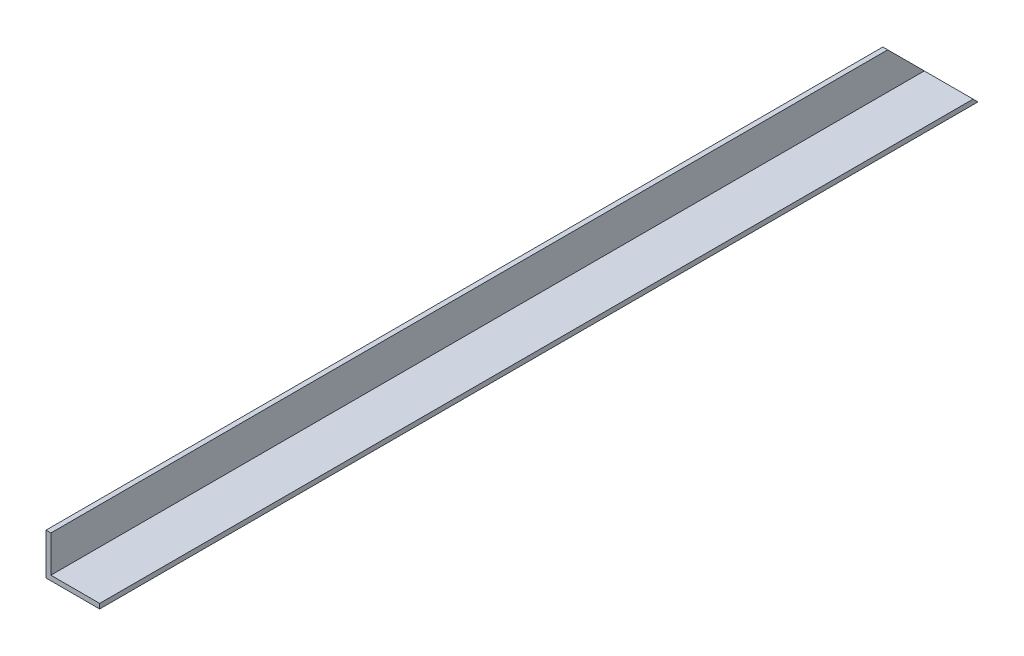
ISO-10303-21;
HEADER;
FILE_DESCRIPTION(('STEP AP214'),'2;1');
FILE_NAME('part.step','',(''),(''),'','','');
FILE_SCHEMA(('AUTOMOTIVE_DESIGN { 1 0 10303 214 1 1 1 1 }'));
ENDSEC;
DATA;
#1=APPLICATION_CONTEXT('core data for automotive mechanical design processes');
#2=APPLICATION_PROTOCOL_DEFINITION('international standard','automotive_design',2000,#1);
#3=PRODUCT_CONTEXT('',#1,'mechanical');
#4=PRODUCT('Part','Part','',(#3));
#5=PRODUCT_RELATED_PRODUCT_CATEGORY('part','',(#4));
#6=PRODUCT_DEFINITION_FORMATION('','',#4);
#7=PRODUCT_DEFINITION_CONTEXT('part definition',#1,'design');
#8=PRODUCT_DEFINITION('design','',#6,#7);
#9=PRODUCT_DEFINITION_SHAPE('','',#8);
#10=(LENGTH_UNIT() NAMED_UNIT(*) SI_UNIT(.MILLI.,.METRE.));
#11=(NAMED_UNIT(*) PLANE_ANGLE_UNIT() SI_UNIT($,.RADIAN.));
#12=(NAMED_UNIT(*) SI_UNIT($,.STERADIAN.) SOLID_ANGLE_UNIT());
#13=UNCERTAINTY_MEASURE_WITH_UNIT(LENGTH_MEASURE(1.E-05),#10,'distance_accuracy_value','');
#14=(GEOMETRIC_REPRESENTATION_CONTEXT(3) GLOBAL_UNCERTAINTY_ASSIGNED_CONTEXT((#13)) GLOBAL_UNIT_ASSIGNED_CONTEXT((#10,
#11,#12)) REPRESENTATION_CONTEXT('',''));
#15=CARTESIAN_POINT('',(0.,0.,0.));
#16=DIRECTION('',(0.,0.,1.));
#17=DIRECTION('',(1.,0.,0.));
#18=AXIS2_PLACEMENT_3D('',#15,#16,#17);
#19=CARTESIAN_POINT('',(22.,0.,360.));
#20=DIRECTION('',(0.,1.,0.));
#21=DIRECTION('',(-1.,0.,0.));
#22=AXIS2_PLACEMENT_3D('',#19,#20,#21);
#23=PLANE('',#22);
#24=DIRECTION('',(1.,0.,0.));
#25=VECTOR('',#24,1.);
#26=CARTESIAN_POINT('',(22.,0.,0.));
#27=LINE('',#26,#25);
#28=CARTESIAN_POINT('',(0.,0.,0.));
#29=VERTEX_POINT('',#28);
#30=CARTESIAN_POINT('',(22.,0.,0.));
#31=VERTEX_POINT('',#30);
#32=EDGE_CURVE('E89',#29,#31,#27,.T.);
#33=ORIENTED_EDGE('',*,*,#32,.T.);
#34=DIRECTION('',(0.,0.,-1.));
#35=VECTOR('',#34,1.);
#36=CARTESIAN_POINT('',(22.,0.,360.));
#37=LINE('',#36,#35);
#38=CARTESIAN_POINT('',(22.,0.,360.));
#39=VERTEX_POINT('',#38);
#40=EDGE_CURVE('E11',#39,#31,#37,.T.);
#41=ORIENTED_EDGE('',*,*,#40,.F.);
#42=DIRECTION('',(1.,0.,0.));
#43=VECTOR('',#42,1.);
#44=CARTESIAN_POINT('',(22.,0.,360.));
#45=LINE('',#44,#43);
#46=CARTESIAN_POINT('',(0.,0.,360.));
#47=VERTEX_POINT('',#46);
#48=EDGE_CURVE('E99',#47,#39,#45,.T.);
#49=ORIENTED_EDGE('',*,*,#48,.F.);
#50=DIRECTION('',(0.,0.,-1.));
#51=VECTOR('',#50,1.);
#52=CARTESIAN_POINT('',(0.,0.,360.));
#53=LINE('',#52,#51);
#54=EDGE_CURVE('E104',#47,#29,#53,.T.);
#55=ORIENTED_EDGE('',*,*,#54,.T.);
#56=EDGE_LOOP('',(#33,#41,#49,#55));
#57=FACE_BOUND('',#56,.T.);
#58=ADVANCED_FACE('F41',(#57),#23,.F.);
#59=CARTESIAN_POINT('',(22.,2.,360.));
#60=DIRECTION('',(-1.,0.,0.));
#61=DIRECTION('',(0.,0.,1.));
#62=AXIS2_PLACEMENT_3D('',#59,#60,#61);
#63=PLANE('',#62);
#64=ORIENTED_EDGE('',*,*,#40,.T.);
#65=DIRECTION('',(0.,0.707106781186552,0.707106781186543));
#66=VECTOR('',#65,1.);
#67=CARTESIAN_POINT('',(22.,181.,180.999999999998));
#68=LINE('',#67,#66);
#69=CARTESIAN_POINT('',(22.,2.,1.99999999999995));
#70=VERTEX_POINT('',#69);
#71=EDGE_CURVE('E95',#31,#70,#68,.T.);
#72=ORIENTED_EDGE('',*,*,#71,.T.);
#73=DIRECTION('',(0.,0.,-1.));
#74=VECTOR('',#73,1.);
#75=CARTESIAN_POINT('',(22.,2.,360.));
#76=LINE('',#75,#74);
#77=CARTESIAN_POINT('',(22.,2.,360.));
#78=VERTEX_POINT('',#77);
#79=EDGE_CURVE('E49',#78,#70,#76,.T.);
#80=ORIENTED_EDGE('',*,*,#79,.F.);
#81=DIRECTION('',(0.,1.,0.));
#82=VECTOR('',#81,1.);
#83=CARTESIAN_POINT('',(22.,2.,360.));
#84=LINE('',#83,#82);
#85=EDGE_CURVE('E131',#39,#78,#84,.T.);
#86=ORIENTED_EDGE('',*,*,#85,.F.);
#87=EDGE_LOOP('',(#64,#72,#80,#86));
#88=FACE_BOUND('',#87,.T.);
#89=ADVANCED_FACE('F130',(#88),#63,.F.);
#90=CARTESIAN_POINT('',(2.,2.,360.));
#91=DIRECTION('',(0.,-1.,0.));
#92=DIRECTION('',(0.,0.,-1.));
#93=AXIS2_PLACEMENT_3D('',#90,#91,#92);
#94=PLANE('',#93);
#95=ORIENTED_EDGE('',*,*,#79,.T.);
#96=DIRECTION('',(-1.,0.,0.));
#97=VECTOR('',#96,1.);
#98=CARTESIAN_POINT('',(2.,2.,1.99999999999995));
#99=LINE('',#98,#97);
#100=CARTESIAN_POINT('',(2.,2.00000000000003,2.));
#101=VERTEX_POINT('',#100);
#102=EDGE_CURVE('E127',#70,#101,#99,.T.);
#103=ORIENTED_EDGE('',*,*,#102,.T.);
#104=DIRECTION('',(0.,0.,-1.));
#105=VECTOR('',#104,1.);
#106=CARTESIAN_POINT('',(2.,2.,360.));
#107=LINE('',#106,#105);
#108=CARTESIAN_POINT('',(2.,2.,360.));
#109=VERTEX_POINT('',#108);
#110=EDGE_CURVE('E118',#109,#101,#107,.T.);
#111=ORIENTED_EDGE('',*,*,#110,.F.);
#112=DIRECTION('',(-1.,0.,0.));
#113=VECTOR('',#112,1.);
#114=CARTESIAN_POINT('',(2.,2.,360.));
#115=LINE('',#114,#113);
#116=EDGE_CURVE('E128',#78,#109,#115,.T.);
#117=ORIENTED_EDGE('',*,*,#116,.F.);
#118=EDGE_LOOP('',(#95,#103,#111,#117));
#119=FACE_BOUND('',#118,.T.);
#120=ADVANCED_FACE('F125',(#119),#94,.F.);
#121=CARTESIAN_POINT('',(2.,17.,360.));
#122=DIRECTION('',(-1.,0.,0.));
#123=DIRECTION('',(0.,-1.,0.));
#124=AXIS2_PLACEMENT_3D('',#121,#122,#123);
#125=PLANE('',#124);
#126=ORIENTED_EDGE('',*,*,#110,.T.);
#127=DIRECTION('',(0.,0.707106781186552,0.707106781186543));
#128=VECTOR('',#127,1.);
#129=CARTESIAN_POINT('',(1.99999999999998,188.5,188.499999999998));
#130=LINE('',#129,#128);
#131=CARTESIAN_POINT('',(2.00000000000011,17.,16.9999999999998));
#132=VERTEX_POINT('',#131);
#133=EDGE_CURVE('E133',#101,#132,#130,.T.);
#134=ORIENTED_EDGE('',*,*,#133,.T.);
#135=DIRECTION('',(0.,0.,-1.));
#136=VECTOR('',#135,1.);
#137=CARTESIAN_POINT('',(2.,17.,360.));
#138=LINE('',#137,#136);
#139=CARTESIAN_POINT('',(2.,17.,360.));
#140=VERTEX_POINT('',#139);
#141=EDGE_CURVE('E111',#140,#132,#138,.T.);
#142=ORIENTED_EDGE('',*,*,#141,.F.);
#143=DIRECTION('',(0.,1.,0.));
#144=VECTOR('',#143,1.);
#145=CARTESIAN_POINT('',(2.,17.,360.));
#146=LINE('',#145,#144);
#147=EDGE_CURVE('E140',#109,#140,#146,.T.);
#148=ORIENTED_EDGE('',*,*,#147,.F.);
#149=EDGE_LOOP('',(#126,#134,#142,#148));
#150=FACE_BOUND('',#149,.T.);
#151=ADVANCED_FACE('F151',(#150),#125,.F.);
#152=CARTESIAN_POINT('',(0.,17.,360.));
#153=DIRECTION('',(0.,-1.,0.));
#154=DIRECTION('',(0.,0.,-1.));
#155=AXIS2_PLACEMENT_3D('',#152,#153,#154);
#156=PLANE('',#155);
#157=ORIENTED_EDGE('',*,*,#141,.T.);
#158=DIRECTION('',(-1.,0.,0.));
#159=VECTOR('',#158,1.);
#160=CARTESIAN_POINT('',(360.,17.,16.9999999999998));
#161=LINE('',#160,#159);
#162=CARTESIAN_POINT('',(0.,17.,16.9999999999998));
#163=VERTEX_POINT('',#162);
#164=EDGE_CURVE('E108',#132,#163,#161,.T.);
#165=ORIENTED_EDGE('',*,*,#164,.T.);
#166=DIRECTION('',(0.,0.,-1.));
#167=VECTOR('',#166,1.);
#168=CARTESIAN_POINT('',(0.,17.,360.));
#169=LINE('',#168,#167);
#170=CARTESIAN_POINT('',(0.,17.,360.));
#171=VERTEX_POINT('',#170);
#172=EDGE_CURVE('E107',#171,#163,#169,.T.);
#173=ORIENTED_EDGE('',*,*,#172,.F.);
#174=DIRECTION('',(-1.,0.,0.));
#175=VECTOR('',#174,1.);
#176=CARTESIAN_POINT('',(0.,17.,360.));
#177=LINE('',#176,#175);
#178=EDGE_CURVE('E113',#140,#171,#177,.T.);
#179=ORIENTED_EDGE('',*,*,#178,.F.);
#180=EDGE_LOOP('',(#157,#165,#173,#179));
#181=FACE_BOUND('',#180,.T.);
#182=ADVANCED_FACE('F147',(#181),#156,.F.);
#183=CARTESIAN_POINT('',(0.,0.,360.));
#184=DIRECTION('',(1.,0.,0.));
#185=DIRECTION('',(0.,0.,-1.));
#186=AXIS2_PLACEMENT_3D('',#183,#184,#185);
#187=PLANE('',#186);
#188=ORIENTED_EDGE('',*,*,#172,.T.);
#189=DIRECTION('',(0.,0.707106781186552,0.707106781186543));
#190=VECTOR('',#189,1.);
#191=CARTESIAN_POINT('',(0.,0.,0.));
#192=LINE('',#191,#190);
#193=EDGE_CURVE('E92',#29,#163,#192,.T.);
#194=ORIENTED_EDGE('',*,*,#193,.F.);
#195=ORIENTED_EDGE('',*,*,#54,.F.);
#196=DIRECTION('',(0.,-1.,0.));
#197=VECTOR('',#196,1.);
#198=CARTESIAN_POINT('',(0.,0.,360.));
#199=LINE('',#198,#197);
#200=EDGE_CURVE('E56',#171,#47,#199,.T.);
#201=ORIENTED_EDGE('',*,*,#200,.F.);
#202=EDGE_LOOP('',(#188,#194,#195,#201));
#203=FACE_BOUND('',#202,.T.);
#204=ADVANCED_FACE('F103',(#203),#187,.F.);
#205=CARTESIAN_POINT('',(0.,0.,360.));
#206=DIRECTION('',(0.,0.,-1.));
#207=DIRECTION('',(-1.,0.,0.));
#208=AXIS2_PLACEMENT_3D('',#205,#206,#207);
#209=PLANE('',#208);
#210=ORIENTED_EDGE('',*,*,#48,.T.);
#211=ORIENTED_EDGE('',*,*,#85,.T.);
#212=ORIENTED_EDGE('',*,*,#116,.T.);
#213=ORIENTED_EDGE('',*,*,#147,.T.);
#214=ORIENTED_EDGE('',*,*,#178,.T.);
#215=ORIENTED_EDGE('',*,*,#200,.T.);
#216=EDGE_LOOP('',(#210,#211,#212,#213,#214,#215));
#217=FACE_BOUND('',#216,.T.);
#218=ADVANCED_FACE('F143',(#217),#209,.F.);
#219=CARTESIAN_POINT('',(360.,0.,0.));
#220=DIRECTION('',(0.,-0.707106781186543,0.707106781186552));
#221=DIRECTION('',(0.,-0.707106781186552,-0.707106781186543));
#222=AXIS2_PLACEMENT_3D('',#219,#220,#221);
#223=PLANE('',#222);
#224=ORIENTED_EDGE('',*,*,#32,.F.);
#225=ORIENTED_EDGE('',*,*,#193,.T.);
#226=ORIENTED_EDGE('',*,*,#164,.F.);
#227=ORIENTED_EDGE('',*,*,#133,.F.);
#228=ORIENTED_EDGE('',*,*,#102,.F.);
#229=ORIENTED_EDGE('',*,*,#71,.F.);
#230=EDGE_LOOP('',(#224,#225,#226,#227,#228,#229));
#231=FACE_BOUND('',#230,.T.);
#232=ADVANCED_FACE('F91',(#231),#223,.F.);
#233=CLOSED_SHELL('',(#58,#89,#120,#151,#182,#204,#218,#232));
#234=MANIFOLD_SOLID_BREP('B2',#233);
#235=ADVANCED_BREP_SHAPE_REPRESENTATION('',(#18,#234),#14);
#236=SHAPE_DEFINITION_REPRESENTATION(#9,#235);
ENDSEC;
END-ISO-10303-21;
